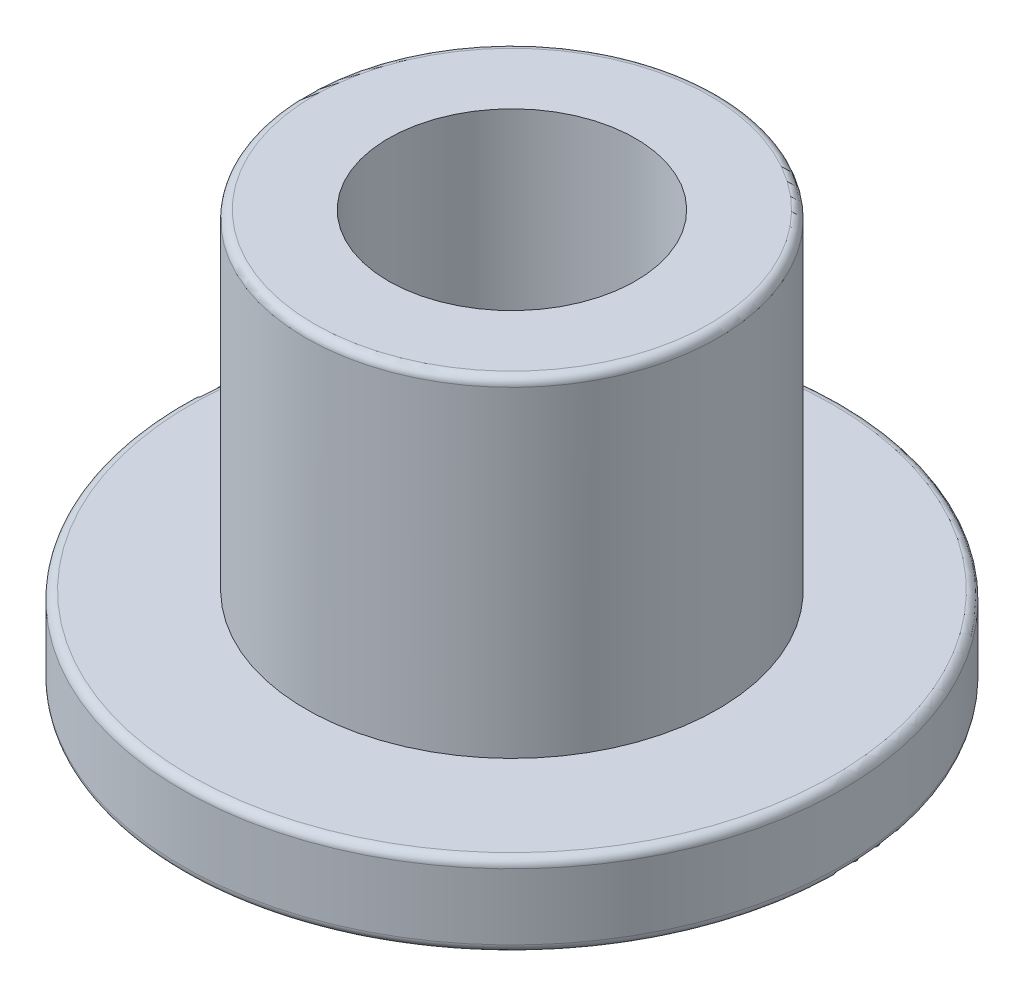
ISO-10303-21;
HEADER;
FILE_DESCRIPTION(('STEP AP214'),'2;1');
FILE_NAME('part.step','',(''),(''),'','','');
FILE_SCHEMA(('AUTOMOTIVE_DESIGN { 1 0 10303 214 1 1 1 1 }'));
ENDSEC;
DATA;
#1=APPLICATION_CONTEXT('core data for automotive mechanical design processes');
#2=APPLICATION_PROTOCOL_DEFINITION('international standard','automotive_design',2000,#1);
#3=PRODUCT_CONTEXT('',#1,'mechanical');
#4=PRODUCT('Part','Part','',(#3));
#5=PRODUCT_RELATED_PRODUCT_CATEGORY('part','',(#4));
#6=PRODUCT_DEFINITION_FORMATION('','',#4);
#7=PRODUCT_DEFINITION_CONTEXT('part definition',#1,'design');
#8=PRODUCT_DEFINITION('design','',#6,#7);
#9=PRODUCT_DEFINITION_SHAPE('','',#8);
#10=(LENGTH_UNIT() NAMED_UNIT(*) SI_UNIT(.MILLI.,.METRE.));
#11=(NAMED_UNIT(*) PLANE_ANGLE_UNIT() SI_UNIT($,.RADIAN.));
#12=(NAMED_UNIT(*) SI_UNIT($,.STERADIAN.) SOLID_ANGLE_UNIT());
#13=UNCERTAINTY_MEASURE_WITH_UNIT(LENGTH_MEASURE(1.E-05),#10,'distance_accuracy_value','');
#14=(GEOMETRIC_REPRESENTATION_CONTEXT(3) GLOBAL_UNCERTAINTY_ASSIGNED_CONTEXT((#13)) GLOBAL_UNIT_ASSIGNED_CONTEXT((#10,
#11,#12)) REPRESENTATION_CONTEXT('',''));
#15=CARTESIAN_POINT('',(0.,0.,0.));
#16=DIRECTION('',(0.,0.,1.));
#17=DIRECTION('',(1.,0.,0.));
#18=AXIS2_PLACEMENT_3D('',#15,#16,#17);
#19=CARTESIAN_POINT('',(0.,-3.,0.));
#20=DIRECTION('',(0.,-1.,0.));
#21=DIRECTION('',(0.,0.,-1.));
#22=AXIS2_PLACEMENT_3D('',#19,#20,#21);
#23=CYLINDRICAL_SURFACE('',#22,8.);
#24=CARTESIAN_POINT('',(0.,-4.8,0.));
#25=DIRECTION('',(0.,-1.,0.));
#26=DIRECTION('',(0.,0.,-1.));
#27=AXIS2_PLACEMENT_3D('',#24,#25,#26);
#28=CIRCLE('',#27,8.);
#29=CARTESIAN_POINT('',(0.,-4.8,-8.));
#30=VERTEX_POINT('',#29);
#31=EDGE_CURVE('E52',#30,#30,#28,.F.);
#32=ORIENTED_EDGE('',*,*,#31,.T.);
#33=EDGE_LOOP('',(#32));
#34=FACE_BOUND('',#33,.T.);
#35=CARTESIAN_POINT('',(0.,-3.2,0.));
#36=DIRECTION('',(0.,-1.,0.));
#37=DIRECTION('',(0.,0.,-1.));
#38=AXIS2_PLACEMENT_3D('',#35,#36,#37);
#39=CIRCLE('',#38,8.);
#40=CARTESIAN_POINT('',(0.,-3.2,-8.));
#41=VERTEX_POINT('',#40);
#42=EDGE_CURVE('E57',#41,#41,#39,.T.);
#43=ORIENTED_EDGE('',*,*,#42,.T.);
#44=EDGE_LOOP('',(#43));
#45=FACE_BOUND('',#44,.T.);
#46=ADVANCED_FACE('F37',(#34,#45),#23,.T.);
#47=CARTESIAN_POINT('',(0.,-3.,0.));
#48=DIRECTION('',(0.,-1.,0.));
#49=DIRECTION('',(0.,0.,-1.));
#50=AXIS2_PLACEMENT_3D('',#47,#48,#49);
#51=PLANE('',#50);
#52=CARTESIAN_POINT('',(0.,-3.,0.));
#53=DIRECTION('',(0.,-1.,0.));
#54=DIRECTION('',(0.,0.,-1.));
#55=AXIS2_PLACEMENT_3D('',#52,#53,#54);
#56=CIRCLE('',#55,7.8);
#57=CARTESIAN_POINT('',(0.,-3.,-7.8));
#58=VERTEX_POINT('',#57);
#59=EDGE_CURVE('E48',#58,#58,#56,.F.);
#60=ORIENTED_EDGE('',*,*,#59,.T.);
#61=EDGE_LOOP('',(#60));
#62=FACE_BOUND('',#61,.T.);
#63=CARTESIAN_POINT('',(0.,-3.,0.));
#64=DIRECTION('',(0.,-1.,0.));
#65=DIRECTION('',(0.,0.,-1.));
#66=AXIS2_PLACEMENT_3D('',#63,#64,#65);
#67=CIRCLE('',#66,5.);
#68=CARTESIAN_POINT('',(0.,-3.,-5.));
#69=VERTEX_POINT('',#68);
#70=EDGE_CURVE('E63',#69,#69,#67,.F.);
#71=ORIENTED_EDGE('',*,*,#70,.F.);
#72=EDGE_LOOP('',(#71));
#73=FACE_BOUND('',#72,.T.);
#74=ADVANCED_FACE('F89',(#62,#73),#51,.F.);
#75=CARTESIAN_POINT('',(0.,-5.,0.));
#76=DIRECTION('',(0.,-1.,0.));
#77=DIRECTION('',(0.,0.,-1.));
#78=AXIS2_PLACEMENT_3D('',#75,#76,#77);
#79=PLANE('',#78);
#80=CARTESIAN_POINT('',(0.,-5.,0.));
#81=DIRECTION('',(0.,-1.,0.));
#82=DIRECTION('',(0.,0.,-1.));
#83=AXIS2_PLACEMENT_3D('',#80,#81,#82);
#84=CIRCLE('',#83,7.8);
#85=CARTESIAN_POINT('',(0.,-5.,-7.8));
#86=VERTEX_POINT('',#85);
#87=EDGE_CURVE('E60',#86,#86,#84,.T.);
#88=ORIENTED_EDGE('',*,*,#87,.T.);
#89=EDGE_LOOP('',(#88));
#90=FACE_BOUND('',#89,.T.);
#91=CARTESIAN_POINT('',(0.,-5.,0.));
#92=DIRECTION('',(0.,1.,0.));
#93=DIRECTION('',(0.,0.,1.));
#94=AXIS2_PLACEMENT_3D('',#91,#92,#93);
#95=CIRCLE('',#94,3.);
#96=CARTESIAN_POINT('',(0.,-5.,3.));
#97=VERTEX_POINT('',#96);
#98=EDGE_CURVE('E67',#97,#97,#95,.T.);
#99=ORIENTED_EDGE('',*,*,#98,.T.);
#100=EDGE_LOOP('',(#99));
#101=FACE_BOUND('',#100,.T.);
#102=ADVANCED_FACE('F86',(#90,#101),#79,.T.);
#103=CARTESIAN_POINT('',(0.,5.,0.));
#104=DIRECTION('',(0.,-1.,0.));
#105=DIRECTION('',(0.,0.,-1.));
#106=AXIS2_PLACEMENT_3D('',#103,#104,#105);
#107=CYLINDRICAL_SURFACE('',#106,5.);
#108=CARTESIAN_POINT('',(0.,4.8,0.));
#109=DIRECTION('',(0.,1.,0.));
#110=DIRECTION('',(0.,0.,1.));
#111=AXIS2_PLACEMENT_3D('',#108,#109,#110);
#112=CIRCLE('',#111,5.);
#113=CARTESIAN_POINT('',(0.,4.8,5.));
#114=VERTEX_POINT('',#113);
#115=EDGE_CURVE('E10',#114,#114,#112,.F.);
#116=ORIENTED_EDGE('',*,*,#115,.T.);
#117=EDGE_LOOP('',(#116));
#118=FACE_BOUND('',#117,.T.);
#119=ORIENTED_EDGE('',*,*,#70,.T.);
#120=EDGE_LOOP('',(#119));
#121=FACE_BOUND('',#120,.T.);
#122=ADVANCED_FACE('F78',(#118,#121),#107,.T.);
#123=CARTESIAN_POINT('',(0.,5.,0.));
#124=DIRECTION('',(0.,1.,0.));
#125=DIRECTION('',(0.,0.,1.));
#126=AXIS2_PLACEMENT_3D('',#123,#124,#125);
#127=PLANE('',#126);
#128=CARTESIAN_POINT('',(0.,5.,0.));
#129=DIRECTION('',(0.,1.,0.));
#130=DIRECTION('',(0.,0.,1.));
#131=AXIS2_PLACEMENT_3D('',#128,#129,#130);
#132=CIRCLE('',#131,4.8);
#133=CARTESIAN_POINT('',(0.,5.,4.8));
#134=VERTEX_POINT('',#133);
#135=EDGE_CURVE('E44',#134,#134,#132,.T.);
#136=ORIENTED_EDGE('',*,*,#135,.T.);
#137=EDGE_LOOP('',(#136));
#138=FACE_BOUND('',#137,.T.);
#139=CARTESIAN_POINT('',(0.,5.,0.));
#140=DIRECTION('',(0.,1.,0.));
#141=DIRECTION('',(0.,0.,1.));
#142=AXIS2_PLACEMENT_3D('',#139,#140,#141);
#143=CIRCLE('',#142,3.);
#144=CARTESIAN_POINT('',(0.,5.,3.));
#145=VERTEX_POINT('',#144);
#146=EDGE_CURVE('E66',#145,#145,#143,.T.);
#147=ORIENTED_EDGE('',*,*,#146,.F.);
#148=EDGE_LOOP('',(#147));
#149=FACE_BOUND('',#148,.T.);
#150=ADVANCED_FACE('F76',(#138,#149),#127,.T.);
#151=CARTESIAN_POINT('',(0.,5.,0.));
#152=DIRECTION('',(0.,-1.,0.));
#153=DIRECTION('',(0.,0.,-1.));
#154=AXIS2_PLACEMENT_3D('',#151,#152,#153);
#155=CYLINDRICAL_SURFACE('',#154,3.);
#156=ORIENTED_EDGE('',*,*,#146,.T.);
#157=EDGE_LOOP('',(#156));
#158=FACE_BOUND('',#157,.T.);
#159=ORIENTED_EDGE('',*,*,#98,.F.);
#160=EDGE_LOOP('',(#159));
#161=FACE_BOUND('',#160,.T.);
#162=ADVANCED_FACE('F73',(#158,#161),#155,.F.);
#163=CARTESIAN_POINT('',(0.,-4.8,0.));
#164=DIRECTION('',(0.,-1.,0.));
#165=DIRECTION('',(0.,0.,-1.));
#166=AXIS2_PLACEMENT_3D('',#163,#164,#165);
#167=TOROIDAL_SURFACE('',#166,7.8,0.2);
#168=ORIENTED_EDGE('',*,*,#31,.F.);
#169=EDGE_LOOP('',(#168));
#170=FACE_BOUND('',#169,.T.);
#171=ORIENTED_EDGE('',*,*,#87,.F.);
#172=EDGE_LOOP('',(#171));
#173=FACE_BOUND('',#172,.T.);
#174=ADVANCED_FACE('F84',(#170,#173),#167,.T.);
#175=CARTESIAN_POINT('',(0.,-3.2,0.));
#176=DIRECTION('',(0.,-1.,0.));
#177=DIRECTION('',(0.,0.,-1.));
#178=AXIS2_PLACEMENT_3D('',#175,#176,#177);
#179=TOROIDAL_SURFACE('',#178,7.8,0.2);
#180=ORIENTED_EDGE('',*,*,#59,.F.);
#181=EDGE_LOOP('',(#180));
#182=FACE_BOUND('',#181,.T.);
#183=ORIENTED_EDGE('',*,*,#42,.F.);
#184=EDGE_LOOP('',(#183));
#185=FACE_BOUND('',#184,.T.);
#186=ADVANCED_FACE('F101',(#182,#185),#179,.T.);
#187=CARTESIAN_POINT('',(0.,4.8,0.));
#188=DIRECTION('',(0.,1.,0.));
#189=DIRECTION('',(0.,0.,1.));
#190=AXIS2_PLACEMENT_3D('',#187,#188,#189);
#191=TOROIDAL_SURFACE('',#190,4.8,0.2);
#192=ORIENTED_EDGE('',*,*,#115,.F.);
#193=EDGE_LOOP('',(#192));
#194=FACE_BOUND('',#193,.T.);
#195=ORIENTED_EDGE('',*,*,#135,.F.);
#196=EDGE_LOOP('',(#195));
#197=FACE_BOUND('',#196,.T.);
#198=ADVANCED_FACE('F39',(#194,#197),#191,.T.);
#199=CLOSED_SHELL('',(#46,#74,#102,#122,#150,#162,#174,#186,#198));
#200=MANIFOLD_SOLID_BREP('B2',#199);
#201=ADVANCED_BREP_SHAPE_REPRESENTATION('',(#18,#200),#14);
#202=SHAPE_DEFINITION_REPRESENTATION(#9,#201);
ENDSEC;
END-ISO-10303-21;
